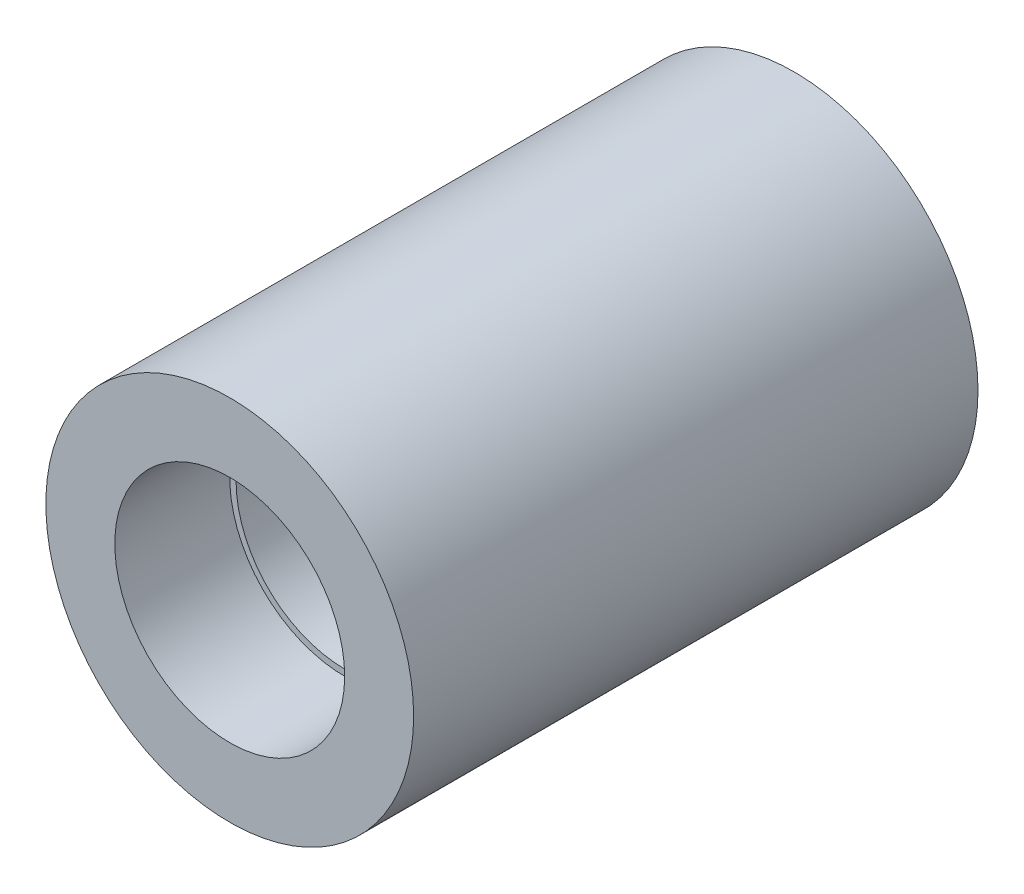
ISO-10303-21;
HEADER;
FILE_DESCRIPTION(('STEP AP214'),'2;1');
FILE_NAME('part.step','',(''),(''),'','','');
FILE_SCHEMA(('AUTOMOTIVE_DESIGN { 1 0 10303 214 1 1 1 1 }'));
ENDSEC;
DATA;
#1=APPLICATION_CONTEXT('core data for automotive mechanical design processes');
#2=APPLICATION_PROTOCOL_DEFINITION('international standard','automotive_design',2000,#1);
#3=PRODUCT_CONTEXT('',#1,'mechanical');
#4=PRODUCT('Part','Part','',(#3));
#5=PRODUCT_RELATED_PRODUCT_CATEGORY('part','',(#4));
#6=PRODUCT_DEFINITION_FORMATION('','',#4);
#7=PRODUCT_DEFINITION_CONTEXT('part definition',#1,'design');
#8=PRODUCT_DEFINITION('design','',#6,#7);
#9=PRODUCT_DEFINITION_SHAPE('','',#8);
#10=(LENGTH_UNIT() NAMED_UNIT(*) SI_UNIT(.MILLI.,.METRE.));
#11=(NAMED_UNIT(*) PLANE_ANGLE_UNIT() SI_UNIT($,.RADIAN.));
#12=(NAMED_UNIT(*) SI_UNIT($,.STERADIAN.) SOLID_ANGLE_UNIT());
#13=UNCERTAINTY_MEASURE_WITH_UNIT(LENGTH_MEASURE(1.E-05),#10,'distance_accuracy_value','');
#14=(GEOMETRIC_REPRESENTATION_CONTEXT(3) GLOBAL_UNCERTAINTY_ASSIGNED_CONTEXT((#13)) GLOBAL_UNIT_ASSIGNED_CONTEXT((#10,
#11,#12)) REPRESENTATION_CONTEXT('',''));
#15=CARTESIAN_POINT('',(0.,0.,0.));
#16=DIRECTION('',(0.,0.,1.));
#17=DIRECTION('',(1.,0.,0.));
#18=AXIS2_PLACEMENT_3D('',#15,#16,#17);
#19=CARTESIAN_POINT('',(0.,0.,3.175));
#20=DIRECTION('',(0.,0.,-1.));
#21=DIRECTION('',(-1.,0.,0.));
#22=AXIS2_PLACEMENT_3D('',#19,#20,#21);
#23=CYLINDRICAL_SURFACE('',#22,3.175);
#24=CARTESIAN_POINT('',(0.,0.,3.175));
#25=DIRECTION('',(0.,0.,1.));
#26=DIRECTION('',(1.,0.,0.));
#27=AXIS2_PLACEMENT_3D('',#24,#25,#26);
#28=CIRCLE('',#27,3.175);
#29=CARTESIAN_POINT('',(3.175,0.,3.175));
#30=VERTEX_POINT('',#29);
#31=EDGE_CURVE('E52',#30,#30,#28,.T.);
#32=ORIENTED_EDGE('',*,*,#31,.T.);
#33=EDGE_LOOP('',(#32));
#34=FACE_BOUND('',#33,.T.);
#35=CARTESIAN_POINT('',(0.,0.,0.));
#36=DIRECTION('',(0.,0.,1.));
#37=DIRECTION('',(1.,0.,0.));
#38=AXIS2_PLACEMENT_3D('',#35,#36,#37);
#39=CIRCLE('',#38,3.175);
#40=CARTESIAN_POINT('',(3.175,0.,0.));
#41=VERTEX_POINT('',#40);
#42=EDGE_CURVE('E48',#41,#41,#39,.T.);
#43=ORIENTED_EDGE('',*,*,#42,.F.);
#44=EDGE_LOOP('',(#43));
#45=FACE_BOUND('',#44,.T.);
#46=ADVANCED_FACE('F44',(#34,#45),#23,.F.);
#47=CARTESIAN_POINT('',(0.,0.,3.175));
#48=DIRECTION('',(0.,0.,-1.));
#49=DIRECTION('',(-1.,0.,0.));
#50=AXIS2_PLACEMENT_3D('',#47,#48,#49);
#51=CYLINDRICAL_SURFACE('',#50,5.08);
#52=CARTESIAN_POINT('',(0.,0.,3.175));
#53=DIRECTION('',(0.,0.,1.));
#54=DIRECTION('',(1.,0.,0.));
#55=AXIS2_PLACEMENT_3D('',#52,#53,#54);
#56=CIRCLE('',#55,5.08);
#57=CARTESIAN_POINT('',(5.08,0.,3.175));
#58=VERTEX_POINT('',#57);
#59=EDGE_CURVE('E10',#58,#58,#56,.T.);
#60=ORIENTED_EDGE('',*,*,#59,.F.);
#61=EDGE_LOOP('',(#60));
#62=FACE_BOUND('',#61,.T.);
#63=CARTESIAN_POINT('',(0.,0.,-12.41552));
#64=DIRECTION('',(0.,0.,1.));
#65=DIRECTION('',(1.,0.,0.));
#66=AXIS2_PLACEMENT_3D('',#63,#64,#65);
#67=CIRCLE('',#66,5.08);
#68=CARTESIAN_POINT('',(5.08,0.,-12.41552));
#69=VERTEX_POINT('',#68);
#70=EDGE_CURVE('E61',#69,#69,#67,.T.);
#71=ORIENTED_EDGE('',*,*,#70,.T.);
#72=EDGE_LOOP('',(#71));
#73=FACE_BOUND('',#72,.T.);
#74=ADVANCED_FACE('F71',(#62,#73),#51,.T.);
#75=CARTESIAN_POINT('',(0.,0.,3.175));
#76=DIRECTION('',(0.,0.,1.));
#77=DIRECTION('',(1.,0.,0.));
#78=AXIS2_PLACEMENT_3D('',#75,#76,#77);
#79=PLANE('',#78);
#80=ORIENTED_EDGE('',*,*,#31,.F.);
#81=EDGE_LOOP('',(#80));
#82=FACE_BOUND('',#81,.T.);
#83=ORIENTED_EDGE('',*,*,#59,.T.);
#84=EDGE_LOOP('',(#83));
#85=FACE_BOUND('',#84,.T.);
#86=ADVANCED_FACE('F89',(#82,#85),#79,.T.);
#87=CARTESIAN_POINT('',(0.,0.,0.));
#88=DIRECTION('',(0.,0.,1.));
#89=DIRECTION('',(1.,0.,0.));
#90=AXIS2_PLACEMENT_3D('',#87,#88,#89);
#91=PLANE('',#90);
#92=CARTESIAN_POINT('',(0.,0.,0.));
#93=DIRECTION('',(0.,0.,1.));
#94=DIRECTION('',(1.,0.,0.));
#95=AXIS2_PLACEMENT_3D('',#92,#93,#94);
#96=CIRCLE('',#95,3.);
#97=CARTESIAN_POINT('',(3.,0.,0.));
#98=VERTEX_POINT('',#97);
#99=EDGE_CURVE('E58',#98,#98,#96,.T.);
#100=ORIENTED_EDGE('',*,*,#99,.F.);
#101=EDGE_LOOP('',(#100));
#102=FACE_BOUND('',#101,.T.);
#103=ORIENTED_EDGE('',*,*,#42,.T.);
#104=EDGE_LOOP('',(#103));
#105=FACE_BOUND('',#104,.T.);
#106=ADVANCED_FACE('F83',(#102,#105),#91,.T.);
#107=CARTESIAN_POINT('',(0.,0.,-12.41552));
#108=DIRECTION('',(0.,0.,1.));
#109=DIRECTION('',(1.,0.,0.));
#110=AXIS2_PLACEMENT_3D('',#107,#108,#109);
#111=CYLINDRICAL_SURFACE('',#110,3.);
#112=CARTESIAN_POINT('',(0.,0.,-12.41552));
#113=DIRECTION('',(0.,0.,1.));
#114=DIRECTION('',(1.,0.,0.));
#115=AXIS2_PLACEMENT_3D('',#112,#113,#114);
#116=CIRCLE('',#115,3.);
#117=CARTESIAN_POINT('',(3.,0.,-12.41552));
#118=VERTEX_POINT('',#117);
#119=EDGE_CURVE('E63',#118,#118,#116,.T.);
#120=ORIENTED_EDGE('',*,*,#119,.F.);
#121=EDGE_LOOP('',(#120));
#122=FACE_BOUND('',#121,.T.);
#123=ORIENTED_EDGE('',*,*,#99,.T.);
#124=EDGE_LOOP('',(#123));
#125=FACE_BOUND('',#124,.T.);
#126=ADVANCED_FACE('F79',(#122,#125),#111,.F.);
#127=CARTESIAN_POINT('',(0.,0.,-12.41552));
#128=DIRECTION('',(0.,0.,1.));
#129=DIRECTION('',(1.,0.,0.));
#130=AXIS2_PLACEMENT_3D('',#127,#128,#129);
#131=PLANE('',#130);
#132=ORIENTED_EDGE('',*,*,#70,.F.);
#133=EDGE_LOOP('',(#132));
#134=FACE_BOUND('',#133,.T.);
#135=ORIENTED_EDGE('',*,*,#119,.T.);
#136=EDGE_LOOP('',(#135));
#137=FACE_BOUND('',#136,.T.);
#138=ADVANCED_FACE('F73',(#134,#137),#131,.F.);
#139=CLOSED_SHELL('',(#46,#74,#86,#106,#126,#138));
#140=MANIFOLD_SOLID_BREP('B2',#139);
#141=ADVANCED_BREP_SHAPE_REPRESENTATION('',(#18,#140),#14);
#142=SHAPE_DEFINITION_REPRESENTATION(#9,#141);
ENDSEC;
END-ISO-10303-21;
